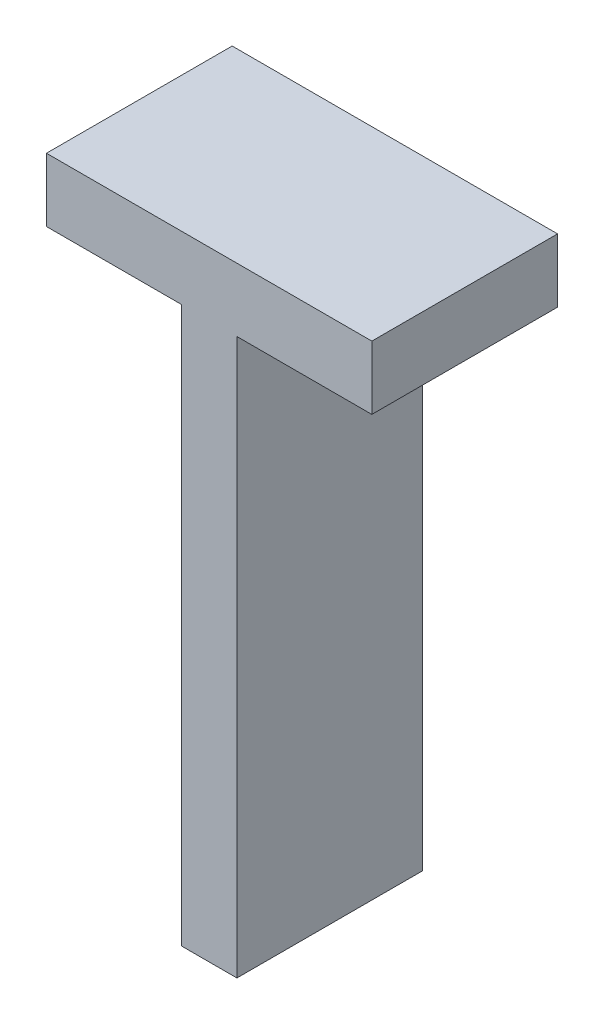
ISO-10303-21;
HEADER;
FILE_DESCRIPTION(('STEP AP214'),'2;1');
FILE_NAME('part.step','',(''),(''),'','','');
FILE_SCHEMA(('AUTOMOTIVE_DESIGN { 1 0 10303 214 1 1 1 1 }'));
ENDSEC;
DATA;
#1=APPLICATION_CONTEXT('core data for automotive mechanical design processes');
#2=APPLICATION_PROTOCOL_DEFINITION('international standard','automotive_design',2000,#1);
#3=PRODUCT_CONTEXT('',#1,'mechanical');
#4=PRODUCT('Part','Part','',(#3));
#5=PRODUCT_RELATED_PRODUCT_CATEGORY('part','',(#4));
#6=PRODUCT_DEFINITION_FORMATION('','',#4);
#7=PRODUCT_DEFINITION_CONTEXT('part definition',#1,'design');
#8=PRODUCT_DEFINITION('design','',#6,#7);
#9=PRODUCT_DEFINITION_SHAPE('','',#8);
#10=(LENGTH_UNIT() NAMED_UNIT(*) SI_UNIT(.MILLI.,.METRE.));
#11=(NAMED_UNIT(*) PLANE_ANGLE_UNIT() SI_UNIT($,.RADIAN.));
#12=(NAMED_UNIT(*) SI_UNIT($,.STERADIAN.) SOLID_ANGLE_UNIT());
#13=UNCERTAINTY_MEASURE_WITH_UNIT(LENGTH_MEASURE(1.E-05),#10,'distance_accuracy_value','');
#14=(GEOMETRIC_REPRESENTATION_CONTEXT(3) GLOBAL_UNCERTAINTY_ASSIGNED_CONTEXT((#13)) GLOBAL_UNIT_ASSIGNED_CONTEXT((#10,
#11,#12)) REPRESENTATION_CONTEXT('',''));
#15=CARTESIAN_POINT('',(0.,0.,0.));
#16=DIRECTION('',(0.,0.,1.));
#17=DIRECTION('',(1.,0.,0.));
#18=AXIS2_PLACEMENT_3D('',#15,#16,#17);
#19=CARTESIAN_POINT('',(-54.919644813049,-18.3829395890513,1.5));
#20=DIRECTION('',(0.,-1.,0.));
#21=DIRECTION('',(0.,0.,-1.));
#22=AXIS2_PLACEMENT_3D('',#19,#20,#21);
#23=PLANE('',#22);
#24=DIRECTION('',(-1.,0.,0.));
#25=VECTOR('',#24,1.);
#26=CARTESIAN_POINT('',(-54.919644813049,-18.3829395890513,0.));
#27=LINE('',#26,#25);
#28=CARTESIAN_POINT('',(-54.919644813049,-18.3829395890513,0.));
#29=VERTEX_POINT('',#28);
#30=CARTESIAN_POINT('',(-56.0093884027926,-18.3829395890513,0.));
#31=VERTEX_POINT('',#30);
#32=EDGE_CURVE('E130',#29,#31,#27,.T.);
#33=ORIENTED_EDGE('',*,*,#32,.F.);
#34=DIRECTION('',(0.,0.,-1.));
#35=VECTOR('',#34,1.);
#36=CARTESIAN_POINT('',(-54.919644813049,-18.3829395890513,1.5));
#37=LINE('',#36,#35);
#38=CARTESIAN_POINT('',(-54.919644813049,-18.3829395890513,1.5));
#39=VERTEX_POINT('',#38);
#40=EDGE_CURVE('E11',#39,#29,#37,.T.);
#41=ORIENTED_EDGE('',*,*,#40,.F.);
#42=DIRECTION('',(-1.,0.,0.));
#43=VECTOR('',#42,1.);
#44=CARTESIAN_POINT('',(-54.919644813049,-18.3829395890513,1.5));
#45=LINE('',#44,#43);
#46=CARTESIAN_POINT('',(-56.0093884027926,-18.3829395890513,1.5));
#47=VERTEX_POINT('',#46);
#48=EDGE_CURVE('E150',#39,#47,#45,.T.);
#49=ORIENTED_EDGE('',*,*,#48,.T.);
#50=DIRECTION('',(0.,0.,-1.));
#51=VECTOR('',#50,1.);
#52=CARTESIAN_POINT('',(-56.0093884027926,-18.3829395890513,1.5));
#53=LINE('',#52,#51);
#54=EDGE_CURVE('E36',#47,#31,#53,.T.);
#55=ORIENTED_EDGE('',*,*,#54,.T.);
#56=EDGE_LOOP('',(#33,#41,#49,#55));
#57=FACE_BOUND('',#56,.T.);
#58=ADVANCED_FACE('F33',(#57),#23,.T.);
#59=CARTESIAN_POINT('',(-54.919644813049,-22.8701190762308,1.5));
#60=DIRECTION('',(-1.,0.,0.));
#61=DIRECTION('',(0.,0.,1.));
#62=AXIS2_PLACEMENT_3D('',#59,#60,#61);
#63=PLANE('',#62);
#64=DIRECTION('',(0.,1.,0.));
#65=VECTOR('',#64,1.);
#66=CARTESIAN_POINT('',(-54.919644813049,-22.8701190762308,0.));
#67=LINE('',#66,#65);
#68=CARTESIAN_POINT('',(-54.919644813049,-22.8701190762308,0.));
#69=VERTEX_POINT('',#68);
#70=EDGE_CURVE('E148',#69,#29,#67,.T.);
#71=ORIENTED_EDGE('',*,*,#70,.F.);
#72=DIRECTION('',(0.,0.,-1.));
#73=VECTOR('',#72,1.);
#74=CARTESIAN_POINT('',(-54.919644813049,-22.8701190762308,1.5));
#75=LINE('',#74,#73);
#76=CARTESIAN_POINT('',(-54.919644813049,-22.8701190762308,1.5));
#77=VERTEX_POINT('',#76);
#78=EDGE_CURVE('E42',#77,#69,#75,.T.);
#79=ORIENTED_EDGE('',*,*,#78,.F.);
#80=DIRECTION('',(0.,1.,0.));
#81=VECTOR('',#80,1.);
#82=CARTESIAN_POINT('',(-54.919644813049,-22.8701190762308,1.5));
#83=LINE('',#82,#81);
#84=EDGE_CURVE('E120',#77,#39,#83,.T.);
#85=ORIENTED_EDGE('',*,*,#84,.T.);
#86=ORIENTED_EDGE('',*,*,#40,.T.);
#87=EDGE_LOOP('',(#71,#79,#85,#86));
#88=FACE_BOUND('',#87,.T.);
#89=ADVANCED_FACE('F162',(#88),#63,.T.);
#90=CARTESIAN_POINT('',(-54.4709268643311,-22.8701190762308,1.5));
#91=DIRECTION('',(0.,-1.,0.));
#92=DIRECTION('',(0.,0.,-1.));
#93=AXIS2_PLACEMENT_3D('',#90,#91,#92);
#94=PLANE('',#93);
#95=DIRECTION('',(-1.,0.,0.));
#96=VECTOR('',#95,1.);
#97=CARTESIAN_POINT('',(-54.4709268643311,-22.8701190762308,0.));
#98=LINE('',#97,#96);
#99=CARTESIAN_POINT('',(-54.4709268643311,-22.8701190762308,0.));
#100=VERTEX_POINT('',#99);
#101=EDGE_CURVE('E107',#100,#69,#98,.T.);
#102=ORIENTED_EDGE('',*,*,#101,.F.);
#103=DIRECTION('',(0.,0.,-1.));
#104=VECTOR('',#103,1.);
#105=CARTESIAN_POINT('',(-54.4709268643311,-22.8701190762308,1.5));
#106=LINE('',#105,#104);
#107=CARTESIAN_POINT('',(-54.4709268643311,-22.8701190762308,1.5));
#108=VERTEX_POINT('',#107);
#109=EDGE_CURVE('E102',#108,#100,#106,.T.);
#110=ORIENTED_EDGE('',*,*,#109,.F.);
#111=DIRECTION('',(-1.,0.,0.));
#112=VECTOR('',#111,1.);
#113=CARTESIAN_POINT('',(-54.4709268643311,-22.8701190762308,1.5));
#114=LINE('',#113,#112);
#115=EDGE_CURVE('E105',#108,#77,#114,.T.);
#116=ORIENTED_EDGE('',*,*,#115,.T.);
#117=ORIENTED_EDGE('',*,*,#78,.T.);
#118=EDGE_LOOP('',(#102,#110,#116,#117));
#119=FACE_BOUND('',#118,.T.);
#120=ADVANCED_FACE('F104',(#119),#94,.T.);
#121=CARTESIAN_POINT('',(-54.4709268643311,-18.3829395890513,1.5));
#122=DIRECTION('',(1.,0.,0.));
#123=DIRECTION('',(0.,0.,-1.));
#124=AXIS2_PLACEMENT_3D('',#121,#122,#123);
#125=PLANE('',#124);
#126=DIRECTION('',(0.,-1.,0.));
#127=VECTOR('',#126,1.);
#128=CARTESIAN_POINT('',(-54.4709268643311,-18.3829395890513,0.));
#129=LINE('',#128,#127);
#130=CARTESIAN_POINT('',(-54.4709268643311,-18.3829395890513,0.));
#131=VERTEX_POINT('',#130);
#132=EDGE_CURVE('E145',#131,#100,#129,.T.);
#133=ORIENTED_EDGE('',*,*,#132,.F.);
#134=DIRECTION('',(0.,0.,-1.));
#135=VECTOR('',#134,1.);
#136=CARTESIAN_POINT('',(-54.4709268643311,-18.3829395890513,1.5));
#137=LINE('',#136,#135);
#138=CARTESIAN_POINT('',(-54.4709268643311,-18.3829395890513,1.5));
#139=VERTEX_POINT('',#138);
#140=EDGE_CURVE('E112',#139,#131,#137,.T.);
#141=ORIENTED_EDGE('',*,*,#140,.F.);
#142=DIRECTION('',(0.,-1.,0.));
#143=VECTOR('',#142,1.);
#144=CARTESIAN_POINT('',(-54.4709268643311,-18.3829395890513,1.5));
#145=LINE('',#144,#143);
#146=EDGE_CURVE('E118',#139,#108,#145,.T.);
#147=ORIENTED_EDGE('',*,*,#146,.T.);
#148=ORIENTED_EDGE('',*,*,#109,.T.);
#149=EDGE_LOOP('',(#133,#141,#147,#148));
#150=FACE_BOUND('',#149,.T.);
#151=ADVANCED_FACE('F122',(#150),#125,.T.);
#152=CARTESIAN_POINT('',(-53.3811832745875,-18.3829395890513,1.5));
#153=DIRECTION('',(0.,-1.,0.));
#154=DIRECTION('',(0.,0.,-1.));
#155=AXIS2_PLACEMENT_3D('',#152,#153,#154);
#156=PLANE('',#155);
#157=DIRECTION('',(-1.,0.,0.));
#158=VECTOR('',#157,1.);
#159=CARTESIAN_POINT('',(-53.3811832745875,-18.3829395890513,0.));
#160=LINE('',#159,#158);
#161=CARTESIAN_POINT('',(-53.3811832745875,-18.3829395890513,0.));
#162=VERTEX_POINT('',#161);
#163=EDGE_CURVE('E142',#162,#131,#160,.T.);
#164=ORIENTED_EDGE('',*,*,#163,.F.);
#165=DIRECTION('',(0.,0.,-1.));
#166=VECTOR('',#165,1.);
#167=CARTESIAN_POINT('',(-53.3811832745875,-18.3829395890513,1.5));
#168=LINE('',#167,#166);
#169=CARTESIAN_POINT('',(-53.3811832745875,-18.3829395890513,1.5));
#170=VERTEX_POINT('',#169);
#171=EDGE_CURVE('E154',#170,#162,#168,.T.);
#172=ORIENTED_EDGE('',*,*,#171,.F.);
#173=DIRECTION('',(-1.,0.,0.));
#174=VECTOR('',#173,1.);
#175=CARTESIAN_POINT('',(-53.3811832745875,-18.3829395890513,1.5));
#176=LINE('',#175,#174);
#177=EDGE_CURVE('E123',#170,#139,#176,.T.);
#178=ORIENTED_EDGE('',*,*,#177,.T.);
#179=ORIENTED_EDGE('',*,*,#140,.T.);
#180=EDGE_LOOP('',(#164,#172,#178,#179));
#181=FACE_BOUND('',#180,.T.);
#182=ADVANCED_FACE('F175',(#181),#156,.T.);
#183=CARTESIAN_POINT('',(-53.3811832745875,-17.8701190762308,1.5));
#184=DIRECTION('',(1.,0.,0.));
#185=DIRECTION('',(0.,0.,-1.));
#186=AXIS2_PLACEMENT_3D('',#183,#184,#185);
#187=PLANE('',#186);
#188=DIRECTION('',(0.,-1.,0.));
#189=VECTOR('',#188,1.);
#190=CARTESIAN_POINT('',(-53.3811832745875,-17.8701190762308,0.));
#191=LINE('',#190,#189);
#192=CARTESIAN_POINT('',(-53.3811832745875,-17.8701190762308,0.));
#193=VERTEX_POINT('',#192);
#194=EDGE_CURVE('E139',#193,#162,#191,.T.);
#195=ORIENTED_EDGE('',*,*,#194,.F.);
#196=DIRECTION('',(0.,0.,-1.));
#197=VECTOR('',#196,1.);
#198=CARTESIAN_POINT('',(-53.3811832745875,-17.8701190762308,1.5));
#199=LINE('',#198,#197);
#200=CARTESIAN_POINT('',(-53.3811832745875,-17.8701190762308,1.5));
#201=VERTEX_POINT('',#200);
#202=EDGE_CURVE('E156',#201,#193,#199,.T.);
#203=ORIENTED_EDGE('',*,*,#202,.F.);
#204=DIRECTION('',(0.,-1.,0.));
#205=VECTOR('',#204,1.);
#206=CARTESIAN_POINT('',(-53.3811832745875,-17.8701190762308,1.5));
#207=LINE('',#206,#205);
#208=EDGE_CURVE('E125',#201,#170,#207,.T.);
#209=ORIENTED_EDGE('',*,*,#208,.T.);
#210=ORIENTED_EDGE('',*,*,#171,.T.);
#211=EDGE_LOOP('',(#195,#203,#209,#210));
#212=FACE_BOUND('',#211,.T.);
#213=ADVANCED_FACE('F178',(#212),#187,.T.);
#214=CARTESIAN_POINT('',(-56.0093884027926,-17.8701190762308,1.5));
#215=DIRECTION('',(0.,1.,0.));
#216=DIRECTION('',(0.,0.,1.));
#217=AXIS2_PLACEMENT_3D('',#214,#215,#216);
#218=PLANE('',#217);
#219=DIRECTION('',(1.,0.,0.));
#220=VECTOR('',#219,1.);
#221=CARTESIAN_POINT('',(-56.0093884027926,-17.8701190762308,0.));
#222=LINE('',#221,#220);
#223=CARTESIAN_POINT('',(-56.0093884027926,-17.8701190762308,0.));
#224=VERTEX_POINT('',#223);
#225=EDGE_CURVE('E136',#224,#193,#222,.T.);
#226=ORIENTED_EDGE('',*,*,#225,.F.);
#227=DIRECTION('',(0.,0.,-1.));
#228=VECTOR('',#227,1.);
#229=CARTESIAN_POINT('',(-56.0093884027926,-17.8701190762308,1.5));
#230=LINE('',#229,#228);
#231=CARTESIAN_POINT('',(-56.0093884027926,-17.8701190762308,1.5));
#232=VERTEX_POINT('',#231);
#233=EDGE_CURVE('E157',#232,#224,#230,.T.);
#234=ORIENTED_EDGE('',*,*,#233,.F.);
#235=DIRECTION('',(1.,0.,0.));
#236=VECTOR('',#235,1.);
#237=CARTESIAN_POINT('',(-56.0093884027926,-17.8701190762308,1.5));
#238=LINE('',#237,#236);
#239=EDGE_CURVE('E289',#232,#201,#238,.T.);
#240=ORIENTED_EDGE('',*,*,#239,.T.);
#241=ORIENTED_EDGE('',*,*,#202,.T.);
#242=EDGE_LOOP('',(#226,#234,#240,#241));
#243=FACE_BOUND('',#242,.T.);
#244=ADVANCED_FACE('F182',(#243),#218,.T.);
#245=CARTESIAN_POINT('',(-56.0093884027926,-18.3829395890513,1.5));
#246=DIRECTION('',(-1.,0.,0.));
#247=DIRECTION('',(0.,0.,1.));
#248=AXIS2_PLACEMENT_3D('',#245,#246,#247);
#249=PLANE('',#248);
#250=DIRECTION('',(0.,1.,0.));
#251=VECTOR('',#250,1.);
#252=CARTESIAN_POINT('',(-56.0093884027926,-18.3829395890513,0.));
#253=LINE('',#252,#251);
#254=EDGE_CURVE('E133',#31,#224,#253,.T.);
#255=ORIENTED_EDGE('',*,*,#254,.F.);
#256=ORIENTED_EDGE('',*,*,#54,.F.);
#257=DIRECTION('',(0.,1.,0.));
#258=VECTOR('',#257,1.);
#259=CARTESIAN_POINT('',(-56.0093884027926,-18.3829395890513,1.5));
#260=LINE('',#259,#258);
#261=EDGE_CURVE('E290',#47,#232,#260,.T.);
#262=ORIENTED_EDGE('',*,*,#261,.T.);
#263=ORIENTED_EDGE('',*,*,#233,.T.);
#264=EDGE_LOOP('',(#255,#256,#262,#263));
#265=FACE_BOUND('',#264,.T.);
#266=ADVANCED_FACE('F159',(#265),#249,.T.);
#267=CARTESIAN_POINT('',(0.,0.,1.5));
#268=DIRECTION('',(0.,0.,-1.));
#269=DIRECTION('',(-1.,0.,0.));
#270=AXIS2_PLACEMENT_3D('',#267,#268,#269);
#271=PLANE('',#270);
#272=ORIENTED_EDGE('',*,*,#48,.F.);
#273=ORIENTED_EDGE('',*,*,#84,.F.);
#274=ORIENTED_EDGE('',*,*,#115,.F.);
#275=ORIENTED_EDGE('',*,*,#146,.F.);
#276=ORIENTED_EDGE('',*,*,#177,.F.);
#277=ORIENTED_EDGE('',*,*,#208,.F.);
#278=ORIENTED_EDGE('',*,*,#239,.F.);
#279=ORIENTED_EDGE('',*,*,#261,.F.);
#280=EDGE_LOOP('',(#272,#273,#274,#275,#276,#277,#278,#279));
#281=FACE_BOUND('',#280,.T.);
#282=ADVANCED_FACE('F116',(#281),#271,.F.);
#283=CARTESIAN_POINT('',(0.,0.,0.));
#284=DIRECTION('',(0.,0.,-1.));
#285=DIRECTION('',(-1.,0.,0.));
#286=AXIS2_PLACEMENT_3D('',#283,#284,#285);
#287=PLANE('',#286);
#288=ORIENTED_EDGE('',*,*,#32,.T.);
#289=ORIENTED_EDGE('',*,*,#254,.T.);
#290=ORIENTED_EDGE('',*,*,#225,.T.);
#291=ORIENTED_EDGE('',*,*,#194,.T.);
#292=ORIENTED_EDGE('',*,*,#163,.T.);
#293=ORIENTED_EDGE('',*,*,#132,.T.);
#294=ORIENTED_EDGE('',*,*,#101,.T.);
#295=ORIENTED_EDGE('',*,*,#70,.T.);
#296=EDGE_LOOP('',(#288,#289,#290,#291,#292,#293,#294,#295));
#297=FACE_BOUND('',#296,.T.);
#298=ADVANCED_FACE('F161',(#297),#287,.T.);
#299=CLOSED_SHELL('',(#58,#89,#120,#151,#182,#213,#244,#266,#282,#298));
#300=MANIFOLD_SOLID_BREP('B2',#299);
#301=ADVANCED_BREP_SHAPE_REPRESENTATION('',(#18,#300),#14);
#302=SHAPE_DEFINITION_REPRESENTATION(#9,#301);
ENDSEC;
END-ISO-10303-21;
